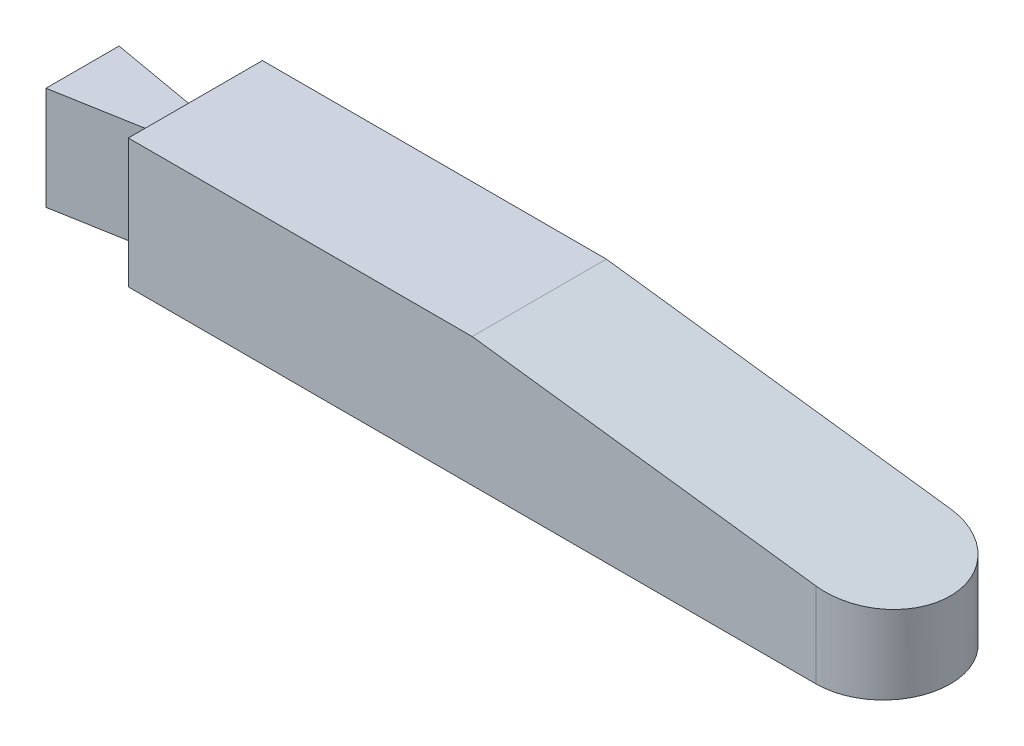
ISO-10303-21;
HEADER;
FILE_DESCRIPTION(('STEP AP214'),'2;1');
FILE_NAME('part.step','',(''),(''),'','','');
FILE_SCHEMA(('AUTOMOTIVE_DESIGN { 1 0 10303 214 1 1 1 1 }'));
ENDSEC;
DATA;
#1=APPLICATION_CONTEXT('core data for automotive mechanical design processes');
#2=APPLICATION_PROTOCOL_DEFINITION('international standard','automotive_design',2000,#1);
#3=PRODUCT_CONTEXT('',#1,'mechanical');
#4=PRODUCT('Part','Part','',(#3));
#5=PRODUCT_RELATED_PRODUCT_CATEGORY('part','',(#4));
#6=PRODUCT_DEFINITION_FORMATION('','',#4);
#7=PRODUCT_DEFINITION_CONTEXT('part definition',#1,'design');
#8=PRODUCT_DEFINITION('design','',#6,#7);
#9=PRODUCT_DEFINITION_SHAPE('','',#8);
#10=(LENGTH_UNIT() NAMED_UNIT(*) SI_UNIT(.MILLI.,.METRE.));
#11=(NAMED_UNIT(*) PLANE_ANGLE_UNIT() SI_UNIT($,.RADIAN.));
#12=(NAMED_UNIT(*) SI_UNIT($,.STERADIAN.) SOLID_ANGLE_UNIT());
#13=UNCERTAINTY_MEASURE_WITH_UNIT(LENGTH_MEASURE(1.E-05),#10,'distance_accuracy_value','');
#14=(GEOMETRIC_REPRESENTATION_CONTEXT(3) GLOBAL_UNCERTAINTY_ASSIGNED_CONTEXT((#13)) GLOBAL_UNIT_ASSIGNED_CONTEXT((#10,
#11,#12)) REPRESENTATION_CONTEXT('',''));
#15=CARTESIAN_POINT('',(0.,0.,0.));
#16=DIRECTION('',(0.,0.,1.));
#17=DIRECTION('',(1.,0.,0.));
#18=AXIS2_PLACEMENT_3D('',#15,#16,#17);
#19=CARTESIAN_POINT('',(-13.5492408882498,38.1,12.2277127990452));
#20=DIRECTION('',(-0.173648177666927,0.,0.984807753012209));
#21=DIRECTION('',(0.984807753012209,0.,0.173648177666927));
#22=AXIS2_PLACEMENT_3D('',#19,#20,#21);
#23=PLANE('',#22);
#24=DIRECTION('',(-0.984807753012208,0.,-0.173648177666927));
#25=VECTOR('',#24,1.);
#26=CARTESIAN_POINT('',(18.9627591117502,30.48,17.9604555958387));
#27=LINE('',#26,#25);
#28=CARTESIAN_POINT('',(18.9627591117502,30.48,17.9604555958387));
#29=VERTEX_POINT('',#28);
#30=CARTESIAN_POINT('',(-13.5492408882498,30.48,12.2277127990452));
#31=VERTEX_POINT('',#30);
#32=EDGE_CURVE('E198',#29,#31,#27,.T.);
#33=ORIENTED_EDGE('',*,*,#32,.F.);
#34=DIRECTION('',(0.,-1.,0.));
#35=VECTOR('',#34,1.);
#36=CARTESIAN_POINT('',(18.9627591117502,38.1,17.9604555958387));
#37=LINE('',#36,#35);
#38=CARTESIAN_POINT('',(18.9627591117502,0.,17.9604555958387));
#39=VERTEX_POINT('',#38);
#40=EDGE_CURVE('E11',#29,#39,#37,.T.);
#41=ORIENTED_EDGE('',*,*,#40,.T.);
#42=DIRECTION('',(-0.984807753012208,0.,-0.173648177666927));
#43=VECTOR('',#42,1.);
#44=CARTESIAN_POINT('',(-13.5492408882498,0.,12.2277127990452));
#45=LINE('',#44,#43);
#46=CARTESIAN_POINT('',(-13.5492408882498,0.,12.2277127990452));
#47=VERTEX_POINT('',#46);
#48=EDGE_CURVE('E124',#39,#47,#45,.T.);
#49=ORIENTED_EDGE('',*,*,#48,.T.);
#50=DIRECTION('',(0.,-1.,0.));
#51=VECTOR('',#50,1.);
#52=CARTESIAN_POINT('',(-13.5492408882498,38.1,12.2277127990452));
#53=LINE('',#52,#51);
#54=EDGE_CURVE('E53',#31,#47,#53,.T.);
#55=ORIENTED_EDGE('',*,*,#54,.F.);
#56=EDGE_LOOP('',(#33,#41,#49,#55));
#57=FACE_BOUND('',#56,.T.);
#58=ADVANCED_FACE('F45',(#57),#23,.F.);
#59=CARTESIAN_POINT('',(-13.5492408882498,38.1,12.2277127990452));
#60=DIRECTION('',(1.,0.,0.));
#61=DIRECTION('',(0.,0.,-1.));
#62=AXIS2_PLACEMENT_3D('',#59,#60,#61);
#63=PLANE('',#62);
#64=DIRECTION('',(0.,0.,1.));
#65=VECTOR('',#64,1.);
#66=CARTESIAN_POINT('',(-13.5492408882498,30.48,12.2277127990452));
#67=LINE('',#66,#65);
#68=CARTESIAN_POINT('',(-13.5492408882498,30.48,33.8177127990452));
#69=VERTEX_POINT('',#68);
#70=EDGE_CURVE('E177',#31,#69,#67,.T.);
#71=ORIENTED_EDGE('',*,*,#70,.F.);
#72=ORIENTED_EDGE('',*,*,#54,.T.);
#73=DIRECTION('',(0.,0.,1.));
#74=VECTOR('',#73,1.);
#75=CARTESIAN_POINT('',(-13.5492408882498,0.,12.2277127990452));
#76=LINE('',#75,#74);
#77=CARTESIAN_POINT('',(-13.5492408882498,0.,33.8177127990452));
#78=VERTEX_POINT('',#77);
#79=EDGE_CURVE('E130',#47,#78,#76,.T.);
#80=ORIENTED_EDGE('',*,*,#79,.T.);
#81=DIRECTION('',(0.,-1.,0.));
#82=VECTOR('',#81,1.);
#83=CARTESIAN_POINT('',(-13.5492408882498,38.1,33.8177127990452));
#84=LINE('',#83,#82);
#85=EDGE_CURVE('E166',#69,#78,#84,.T.);
#86=ORIENTED_EDGE('',*,*,#85,.F.);
#87=EDGE_LOOP('',(#71,#72,#80,#86));
#88=FACE_BOUND('',#87,.T.);
#89=ADVANCED_FACE('F172',(#88),#63,.F.);
#90=CARTESIAN_POINT('',(-13.5492408882498,38.1,33.8177127990452));
#91=DIRECTION('',(-0.173648177666935,0.,-0.984807753012207));
#92=DIRECTION('',(-0.984807753012207,0.,0.173648177666935));
#93=AXIS2_PLACEMENT_3D('',#90,#91,#92);
#94=PLANE('',#93);
#95=DIRECTION('',(0.984807753012207,0.,-0.173648177666935));
#96=VECTOR('',#95,1.);
#97=CARTESIAN_POINT('',(-13.5492408882498,30.48,33.8177127990452));
#98=LINE('',#97,#96);
#99=CARTESIAN_POINT('',(18.9627591117502,30.48,28.0849700022514));
#100=VERTEX_POINT('',#99);
#101=EDGE_CURVE('E133',#69,#100,#98,.T.);
#102=ORIENTED_EDGE('',*,*,#101,.F.);
#103=ORIENTED_EDGE('',*,*,#85,.T.);
#104=DIRECTION('',(0.984807753012207,0.,-0.173648177666935));
#105=VECTOR('',#104,1.);
#106=CARTESIAN_POINT('',(-13.5492408882498,0.,33.8177127990452));
#107=LINE('',#106,#105);
#108=CARTESIAN_POINT('',(18.9627591117502,0.,28.0849700022514));
#109=VERTEX_POINT('',#108);
#110=EDGE_CURVE('E141',#78,#109,#107,.T.);
#111=ORIENTED_EDGE('',*,*,#110,.T.);
#112=DIRECTION('',(0.,-1.,0.));
#113=VECTOR('',#112,1.);
#114=CARTESIAN_POINT('',(18.9627591117502,38.1,28.0849700022514));
#115=LINE('',#114,#113);
#116=EDGE_CURVE('E163',#100,#109,#115,.T.);
#117=ORIENTED_EDGE('',*,*,#116,.F.);
#118=EDGE_LOOP('',(#102,#103,#111,#117));
#119=FACE_BOUND('',#118,.T.);
#120=ADVANCED_FACE('F185',(#119),#94,.F.);
#121=CARTESIAN_POINT('',(18.9627591117502,38.1,42.0125833300448));
#122=DIRECTION('',(1.,0.,0.));
#123=DIRECTION('',(0.,0.,-1.));
#124=AXIS2_PLACEMENT_3D('',#121,#122,#123);
#125=PLANE('',#124);
#126=DIRECTION('',(0.,0.,1.));
#127=VECTOR('',#126,1.);
#128=CARTESIAN_POINT('',(18.9627591117502,0.,42.0125833300448));
#129=LINE('',#128,#127);
#130=CARTESIAN_POINT('',(18.9627591117502,0.,42.0125833300448));
#131=VERTEX_POINT('',#130);
#132=EDGE_CURVE('E145',#109,#131,#129,.T.);
#133=ORIENTED_EDGE('',*,*,#132,.T.);
#134=DIRECTION('',(0.,-1.,0.));
#135=VECTOR('',#134,1.);
#136=CARTESIAN_POINT('',(18.9627591117502,38.1,42.0125833300448));
#137=LINE('',#136,#135);
#138=CARTESIAN_POINT('',(18.9627591117502,38.1,42.0125833300448));
#139=VERTEX_POINT('',#138);
#140=EDGE_CURVE('E159',#139,#131,#137,.T.);
#141=ORIENTED_EDGE('',*,*,#140,.F.);
#142=DIRECTION('',(0.,0.,1.));
#143=VECTOR('',#142,1.);
#144=CARTESIAN_POINT('',(18.9627591117502,38.1,2.38858333004482));
#145=LINE('',#144,#143);
#146=CARTESIAN_POINT('',(18.9627591117502,38.1,2.38858333004482));
#147=VERTEX_POINT('',#146);
#148=EDGE_CURVE('E109',#147,#139,#145,.T.);
#149=ORIENTED_EDGE('',*,*,#148,.F.);
#150=DIRECTION('',(0.,-1.,0.));
#151=VECTOR('',#150,1.);
#152=CARTESIAN_POINT('',(18.9627591117502,38.1,2.38858333004482));
#153=LINE('',#152,#151);
#154=CARTESIAN_POINT('',(18.9627591117502,0.,2.38858333004482));
#155=VERTEX_POINT('',#154);
#156=EDGE_CURVE('E100',#147,#155,#153,.T.);
#157=ORIENTED_EDGE('',*,*,#156,.T.);
#158=DIRECTION('',(0.,0.,1.));
#159=VECTOR('',#158,1.);
#160=CARTESIAN_POINT('',(18.9627591117502,0.,2.38858333004482));
#161=LINE('',#160,#159);
#162=EDGE_CURVE('E116',#155,#39,#161,.T.);
#163=ORIENTED_EDGE('',*,*,#162,.T.);
#164=ORIENTED_EDGE('',*,*,#40,.F.);
#165=DIRECTION('',(0.,0.,-1.));
#166=VECTOR('',#165,1.);
#167=CARTESIAN_POINT('',(18.9627591117502,30.48,28.0849700022514));
#168=LINE('',#167,#166);
#169=EDGE_CURVE('E126',#100,#29,#168,.T.);
#170=ORIENTED_EDGE('',*,*,#169,.F.);
#171=ORIENTED_EDGE('',*,*,#116,.T.);
#172=EDGE_LOOP('',(#133,#141,#149,#157,#163,#164,#170,#171));
#173=FACE_BOUND('',#172,.T.);
#174=ADVANCED_FACE('F114',(#173),#125,.F.);
#175=CARTESIAN_POINT('',(18.9627591117502,38.1,42.0125833300448));
#176=DIRECTION('',(0.,0.,-1.));
#177=DIRECTION('',(-1.,0.,0.));
#178=AXIS2_PLACEMENT_3D('',#175,#176,#177);
#179=PLANE('',#178);
#180=DIRECTION('',(0.,-1.,0.));
#181=VECTOR('',#180,1.);
#182=CARTESIAN_POINT('',(222.16275911175,38.1,42.0125833300448));
#183=LINE('',#182,#181);
#184=CARTESIAN_POINT('',(222.16275911175,25.062054565206,42.0125833300448));
#185=VERTEX_POINT('',#184);
#186=CARTESIAN_POINT('',(222.16275911175,0.,42.0125833300448));
#187=VERTEX_POINT('',#186);
#188=EDGE_CURVE('E156',#185,#187,#183,.T.);
#189=ORIENTED_EDGE('',*,*,#188,.F.);
#190=DIRECTION('',(0.99186650650236,-0.127282493999779,0.));
#191=VECTOR('',#190,1.);
#192=CARTESIAN_POINT('',(120.56275911175,38.1,42.0125833300448));
#193=LINE('',#192,#191);
#194=CARTESIAN_POINT('',(120.56275911175,38.1,42.0125833300448));
#195=VERTEX_POINT('',#194);
#196=EDGE_CURVE('E227',#195,#185,#193,.T.);
#197=ORIENTED_EDGE('',*,*,#196,.F.);
#198=DIRECTION('',(1.,0.,0.));
#199=VECTOR('',#198,1.);
#200=CARTESIAN_POINT('',(18.9627591117502,38.1,42.0125833300448));
#201=LINE('',#200,#199);
#202=EDGE_CURVE('E213',#139,#195,#201,.T.);
#203=ORIENTED_EDGE('',*,*,#202,.F.);
#204=ORIENTED_EDGE('',*,*,#140,.T.);
#205=DIRECTION('',(1.,0.,0.));
#206=VECTOR('',#205,1.);
#207=CARTESIAN_POINT('',(18.9627591117502,0.,42.0125833300448));
#208=LINE('',#207,#206);
#209=EDGE_CURVE('E148',#131,#187,#208,.T.);
#210=ORIENTED_EDGE('',*,*,#209,.T.);
#211=EDGE_LOOP('',(#189,#197,#203,#204,#210));
#212=FACE_BOUND('',#211,.T.);
#213=ADVANCED_FACE('F225',(#212),#179,.F.);
#214=CARTESIAN_POINT('',(222.16275911175,38.1,22.2005833300448));
#215=DIRECTION('',(0.,-1.,0.));
#216=DIRECTION('',(0.,0.,-1.));
#217=AXIS2_PLACEMENT_3D('',#214,#215,#216);
#218=CYLINDRICAL_SURFACE('',#217,19.812);
#219=CARTESIAN_POINT('',(222.16275911175,25.062054565206,22.2005833300448));
#220=DIRECTION('',(-0.127282493999779,-0.99186650650236,0.));
#221=DIRECTION('',(0.99186650650236,-0.127282493999779,0.));
#222=AXIS2_PLACEMENT_3D('',#219,#220,#221);
#223=ELLIPSE('',#222,19.9744621580816,19.812);
#224=CARTESIAN_POINT('',(222.16275911175,25.062054565206,2.38858333004482));
#225=VERTEX_POINT('',#224);
#226=EDGE_CURVE('E200',#225,#185,#223,.T.);
#227=ORIENTED_EDGE('',*,*,#226,.T.);
#228=ORIENTED_EDGE('',*,*,#188,.T.);
#229=CARTESIAN_POINT('',(222.16275911175,0.,22.2005833300448));
#230=DIRECTION('',(0.,1.,0.));
#231=DIRECTION('',(0.,0.,-1.));
#232=AXIS2_PLACEMENT_3D('',#229,#230,#231);
#233=CIRCLE('',#232,19.812);
#234=CARTESIAN_POINT('',(222.16275911175,0.,2.38858333004482));
#235=VERTEX_POINT('',#234);
#236=EDGE_CURVE('E110',#187,#235,#233,.T.);
#237=ORIENTED_EDGE('',*,*,#236,.T.);
#238=DIRECTION('',(0.,-1.,0.));
#239=VECTOR('',#238,1.);
#240=CARTESIAN_POINT('',(222.16275911175,38.1,2.38858333004482));
#241=LINE('',#240,#239);
#242=EDGE_CURVE('E103',#225,#235,#241,.T.);
#243=ORIENTED_EDGE('',*,*,#242,.F.);
#244=EDGE_LOOP('',(#227,#228,#237,#243));
#245=FACE_BOUND('',#244,.T.);
#246=ADVANCED_FACE('F255',(#245),#218,.T.);
#247=CARTESIAN_POINT('',(18.9627591117502,38.1,2.38858333004482));
#248=DIRECTION('',(0.,0.,1.));
#249=DIRECTION('',(1.,0.,0.));
#250=AXIS2_PLACEMENT_3D('',#247,#248,#249);
#251=PLANE('',#250);
#252=DIRECTION('',(-1.,0.,0.));
#253=VECTOR('',#252,1.);
#254=CARTESIAN_POINT('',(18.9627591117502,38.1,2.38858333004482));
#255=LINE('',#254,#253);
#256=CARTESIAN_POINT('',(120.56275911175,38.1,2.38858333004482));
#257=VERTEX_POINT('',#256);
#258=EDGE_CURVE('E68',#257,#147,#255,.T.);
#259=ORIENTED_EDGE('',*,*,#258,.F.);
#260=DIRECTION('',(0.99186650650236,-0.127282493999779,0.));
#261=VECTOR('',#260,1.);
#262=CARTESIAN_POINT('',(120.56275911175,38.1,2.38858333004482));
#263=LINE('',#262,#261);
#264=EDGE_CURVE('E60',#257,#225,#263,.T.);
#265=ORIENTED_EDGE('',*,*,#264,.T.);
#266=ORIENTED_EDGE('',*,*,#242,.T.);
#267=DIRECTION('',(-1.,0.,0.));
#268=VECTOR('',#267,1.);
#269=CARTESIAN_POINT('',(18.9627591117502,0.,2.38858333004482));
#270=LINE('',#269,#268);
#271=EDGE_CURVE('E97',#235,#155,#270,.T.);
#272=ORIENTED_EDGE('',*,*,#271,.T.);
#273=ORIENTED_EDGE('',*,*,#156,.F.);
#274=EDGE_LOOP('',(#259,#265,#266,#272,#273));
#275=FACE_BOUND('',#274,.T.);
#276=ADVANCED_FACE('F99',(#275),#251,.F.);
#277=CARTESIAN_POINT('',(222.16275911175,38.1,22.2005833300448));
#278=DIRECTION('',(0.,-1.,0.));
#279=DIRECTION('',(0.,0.,-1.));
#280=AXIS2_PLACEMENT_3D('',#277,#278,#279);
#281=PLANE('',#280);
#282=ORIENTED_EDGE('',*,*,#202,.T.);
#283=DIRECTION('',(0.,0.,1.));
#284=VECTOR('',#283,1.);
#285=CARTESIAN_POINT('',(120.56275911175,38.1,2.38858333004482));
#286=LINE('',#285,#284);
#287=EDGE_CURVE('E206',#257,#195,#286,.T.);
#288=ORIENTED_EDGE('',*,*,#287,.F.);
#289=ORIENTED_EDGE('',*,*,#258,.T.);
#290=ORIENTED_EDGE('',*,*,#148,.T.);
#291=EDGE_LOOP('',(#282,#288,#289,#290));
#292=FACE_BOUND('',#291,.T.);
#293=ADVANCED_FACE('F219',(#292),#281,.F.);
#294=CARTESIAN_POINT('',(222.16275911175,0.,22.2005833300448));
#295=DIRECTION('',(0.,-1.,0.));
#296=DIRECTION('',(0.,0.,-1.));
#297=AXIS2_PLACEMENT_3D('',#294,#295,#296);
#298=PLANE('',#297);
#299=ORIENTED_EDGE('',*,*,#162,.F.);
#300=ORIENTED_EDGE('',*,*,#271,.F.);
#301=ORIENTED_EDGE('',*,*,#236,.F.);
#302=ORIENTED_EDGE('',*,*,#209,.F.);
#303=ORIENTED_EDGE('',*,*,#132,.F.);
#304=ORIENTED_EDGE('',*,*,#110,.F.);
#305=ORIENTED_EDGE('',*,*,#79,.F.);
#306=ORIENTED_EDGE('',*,*,#48,.F.);
#307=EDGE_LOOP('',(#299,#300,#301,#302,#303,#304,#305,#306));
#308=FACE_BOUND('',#307,.T.);
#309=ADVANCED_FACE('F121',(#308),#298,.T.);
#310=CARTESIAN_POINT('',(0.,30.48,0.));
#311=DIRECTION('',(0.,1.,0.));
#312=DIRECTION('',(0.,0.,1.));
#313=AXIS2_PLACEMENT_3D('',#310,#311,#312);
#314=PLANE('',#313);
#315=ORIENTED_EDGE('',*,*,#32,.T.);
#316=ORIENTED_EDGE('',*,*,#70,.T.);
#317=ORIENTED_EDGE('',*,*,#101,.T.);
#318=ORIENTED_EDGE('',*,*,#169,.T.);
#319=EDGE_LOOP('',(#315,#316,#317,#318));
#320=FACE_BOUND('',#319,.T.);
#321=ADVANCED_FACE('F197',(#320),#314,.T.);
#322=CARTESIAN_POINT('',(120.56275911175,38.1,2.38858333004482));
#323=DIRECTION('',(-0.127282493999779,-0.99186650650236,0.));
#324=DIRECTION('',(0.99186650650236,-0.127282493999779,0.));
#325=AXIS2_PLACEMENT_3D('',#322,#323,#324);
#326=PLANE('',#325);
#327=ORIENTED_EDGE('',*,*,#226,.F.);
#328=ORIENTED_EDGE('',*,*,#264,.F.);
#329=ORIENTED_EDGE('',*,*,#287,.T.);
#330=ORIENTED_EDGE('',*,*,#196,.T.);
#331=EDGE_LOOP('',(#327,#328,#329,#330));
#332=FACE_BOUND('',#331,.T.);
#333=ADVANCED_FACE('F233',(#332),#326,.F.);
#334=CLOSED_SHELL('',(#58,#89,#120,#174,#213,#246,#276,#293,#309,#321,#333));
#335=MANIFOLD_SOLID_BREP('B2',#334);
#336=ADVANCED_BREP_SHAPE_REPRESENTATION('',(#18,#335),#14);
#337=SHAPE_DEFINITION_REPRESENTATION(#9,#336);
ENDSEC;
END-ISO-10303-21;
